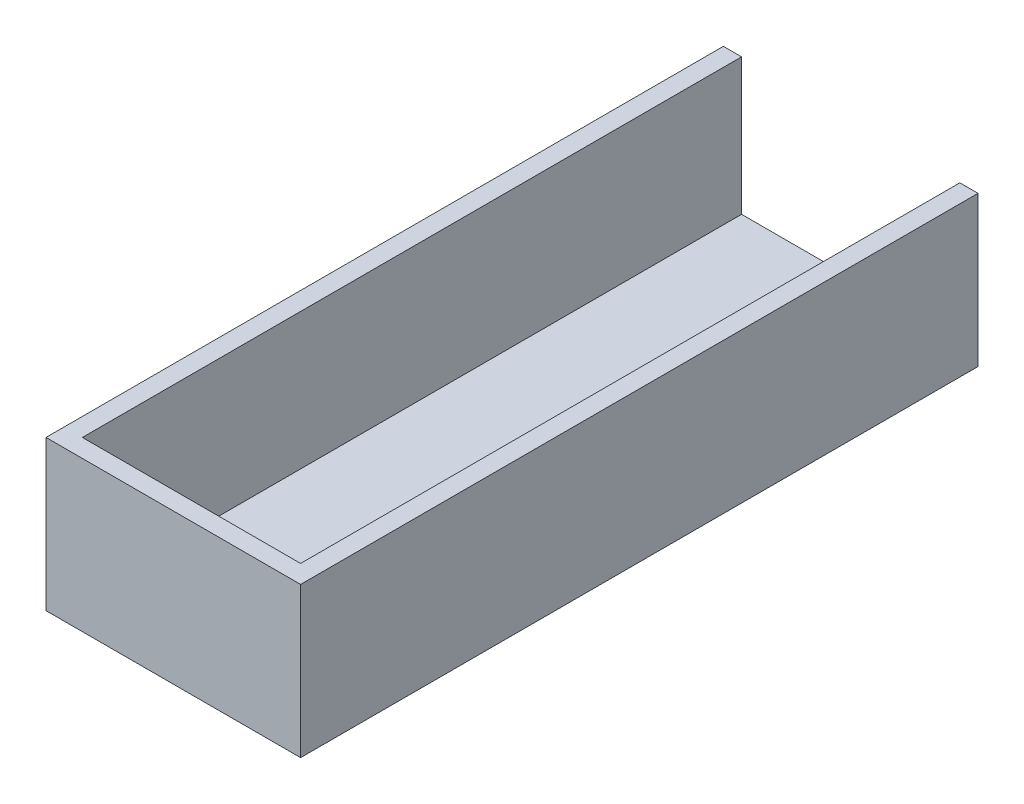
ISO-10303-21;
HEADER;
FILE_DESCRIPTION(('STEP AP214'),'2;1');
FILE_NAME('part.step','',(''),(''),'','','');
FILE_SCHEMA(('AUTOMOTIVE_DESIGN { 1 0 10303 214 1 1 1 1 }'));
ENDSEC;
DATA;
#1=APPLICATION_CONTEXT('core data for automotive mechanical design processes');
#2=APPLICATION_PROTOCOL_DEFINITION('international standard','automotive_design',2000,#1);
#3=PRODUCT_CONTEXT('',#1,'mechanical');
#4=PRODUCT('Part','Part','',(#3));
#5=PRODUCT_RELATED_PRODUCT_CATEGORY('part','',(#4));
#6=PRODUCT_DEFINITION_FORMATION('','',#4);
#7=PRODUCT_DEFINITION_CONTEXT('part definition',#1,'design');
#8=PRODUCT_DEFINITION('design','',#6,#7);
#9=PRODUCT_DEFINITION_SHAPE('','',#8);
#10=(LENGTH_UNIT() NAMED_UNIT(*) SI_UNIT(.MILLI.,.METRE.));
#11=(NAMED_UNIT(*) PLANE_ANGLE_UNIT() SI_UNIT($,.RADIAN.));
#12=(NAMED_UNIT(*) SI_UNIT($,.STERADIAN.) SOLID_ANGLE_UNIT());
#13=UNCERTAINTY_MEASURE_WITH_UNIT(LENGTH_MEASURE(1.E-05),#10,'distance_accuracy_value','');
#14=(GEOMETRIC_REPRESENTATION_CONTEXT(3) GLOBAL_UNCERTAINTY_ASSIGNED_CONTEXT((#13)) GLOBAL_UNIT_ASSIGNED_CONTEXT((#10,
#11,#12)) REPRESENTATION_CONTEXT('',''));
#15=CARTESIAN_POINT('',(0.,0.,0.));
#16=DIRECTION('',(0.,0.,1.));
#17=DIRECTION('',(1.,0.,0.));
#18=AXIS2_PLACEMENT_3D('',#15,#16,#17);
#19=CARTESIAN_POINT('',(28.,33.,-74.5));
#20=DIRECTION('',(-1.,0.,0.));
#21=DIRECTION('',(0.,0.,1.));
#22=AXIS2_PLACEMENT_3D('',#19,#20,#21);
#23=PLANE('',#22);
#24=DIRECTION('',(0.,0.,-1.));
#25=VECTOR('',#24,1.);
#26=CARTESIAN_POINT('',(28.,0.,-74.5));
#27=LINE('',#26,#25);
#28=CARTESIAN_POINT('',(28.,0.,74.5));
#29=VERTEX_POINT('',#28);
#30=CARTESIAN_POINT('',(28.,0.,-74.5));
#31=VERTEX_POINT('',#30);
#32=EDGE_CURVE('E138',#29,#31,#27,.T.);
#33=ORIENTED_EDGE('',*,*,#32,.T.);
#34=DIRECTION('',(0.,-1.,0.));
#35=VECTOR('',#34,1.);
#36=CARTESIAN_POINT('',(28.,33.,-74.5));
#37=LINE('',#36,#35);
#38=CARTESIAN_POINT('',(28.,33.,-74.5));
#39=VERTEX_POINT('',#38);
#40=EDGE_CURVE('E11',#39,#31,#37,.T.);
#41=ORIENTED_EDGE('',*,*,#40,.F.);
#42=DIRECTION('',(0.,0.,-1.));
#43=VECTOR('',#42,1.);
#44=CARTESIAN_POINT('',(28.,33.,-74.5));
#45=LINE('',#44,#43);
#46=CARTESIAN_POINT('',(28.,33.,74.5));
#47=VERTEX_POINT('',#46);
#48=EDGE_CURVE('E142',#47,#39,#45,.T.);
#49=ORIENTED_EDGE('',*,*,#48,.F.);
#50=DIRECTION('',(0.,-1.,0.));
#51=VECTOR('',#50,1.);
#52=CARTESIAN_POINT('',(28.,33.,74.5));
#53=LINE('',#52,#51);
#54=EDGE_CURVE('E149',#47,#29,#53,.T.);
#55=ORIENTED_EDGE('',*,*,#54,.T.);
#56=EDGE_LOOP('',(#33,#41,#49,#55));
#57=FACE_BOUND('',#56,.T.);
#58=ADVANCED_FACE('F33',(#57),#23,.F.);
#59=CARTESIAN_POINT('',(-28.,33.,-74.5));
#60=DIRECTION('',(0.,0.,1.));
#61=DIRECTION('',(1.,0.,0.));
#62=AXIS2_PLACEMENT_3D('',#59,#60,#61);
#63=PLANE('',#62);
#64=DIRECTION('',(-1.,0.,0.));
#65=VECTOR('',#64,1.);
#66=CARTESIAN_POINT('',(-28.,33.,-74.5));
#67=LINE('',#66,#65);
#68=CARTESIAN_POINT('',(-24.,33.,-74.5));
#69=VERTEX_POINT('',#68);
#70=CARTESIAN_POINT('',(-28.,33.,-74.5));
#71=VERTEX_POINT('',#70);
#72=EDGE_CURVE('E144',#69,#71,#67,.T.);
#73=ORIENTED_EDGE('',*,*,#72,.F.);
#74=DIRECTION('',(0.,1.,0.));
#75=VECTOR('',#74,1.);
#76=CARTESIAN_POINT('',(-24.,3.,-74.5));
#77=LINE('',#76,#75);
#78=CARTESIAN_POINT('',(-24.,3.,-74.5));
#79=VERTEX_POINT('',#78);
#80=EDGE_CURVE('E136',#79,#69,#77,.T.);
#81=ORIENTED_EDGE('',*,*,#80,.F.);
#82=DIRECTION('',(-1.,0.,0.));
#83=VECTOR('',#82,1.);
#84=CARTESIAN_POINT('',(-24.,3.,-74.5));
#85=LINE('',#84,#83);
#86=CARTESIAN_POINT('',(24.,3.,-74.5));
#87=VERTEX_POINT('',#86);
#88=EDGE_CURVE('E114',#87,#79,#85,.T.);
#89=ORIENTED_EDGE('',*,*,#88,.F.);
#90=DIRECTION('',(0.,1.,0.));
#91=VECTOR('',#90,1.);
#92=CARTESIAN_POINT('',(24.,3.,-74.5));
#93=LINE('',#92,#91);
#94=CARTESIAN_POINT('',(24.,33.,-74.5));
#95=VERTEX_POINT('',#94);
#96=EDGE_CURVE('E139',#87,#95,#93,.T.);
#97=ORIENTED_EDGE('',*,*,#96,.T.);
#98=EDGE_CURVE('E84',#39,#95,#67,.T.);
#99=ORIENTED_EDGE('',*,*,#98,.F.);
#100=ORIENTED_EDGE('',*,*,#40,.T.);
#101=DIRECTION('',(-1.,0.,0.));
#102=VECTOR('',#101,1.);
#103=CARTESIAN_POINT('',(-28.,0.,-74.5));
#104=LINE('',#103,#102);
#105=CARTESIAN_POINT('',(-28.,0.,-74.5));
#106=VERTEX_POINT('',#105);
#107=EDGE_CURVE('E152',#31,#106,#104,.T.);
#108=ORIENTED_EDGE('',*,*,#107,.T.);
#109=DIRECTION('',(0.,-1.,0.));
#110=VECTOR('',#109,1.);
#111=CARTESIAN_POINT('',(-28.,33.,-74.5));
#112=LINE('',#111,#110);
#113=EDGE_CURVE('E40',#71,#106,#112,.T.);
#114=ORIENTED_EDGE('',*,*,#113,.F.);
#115=EDGE_LOOP('',(#73,#81,#89,#97,#99,#100,#108,#114));
#116=FACE_BOUND('',#115,.T.);
#117=ADVANCED_FACE('F182',(#116),#63,.F.);
#118=CARTESIAN_POINT('',(-28.,33.,-74.5));
#119=DIRECTION('',(1.,0.,0.));
#120=DIRECTION('',(0.,0.,-1.));
#121=AXIS2_PLACEMENT_3D('',#118,#119,#120);
#122=PLANE('',#121);
#123=DIRECTION('',(0.,0.,1.));
#124=VECTOR('',#123,1.);
#125=CARTESIAN_POINT('',(-28.,0.,-74.5));
#126=LINE('',#125,#124);
#127=CARTESIAN_POINT('',(-28.,0.,74.5));
#128=VERTEX_POINT('',#127);
#129=EDGE_CURVE('E154',#106,#128,#126,.T.);
#130=ORIENTED_EDGE('',*,*,#129,.T.);
#131=DIRECTION('',(0.,-1.,0.));
#132=VECTOR('',#131,1.);
#133=CARTESIAN_POINT('',(-28.,33.,74.5));
#134=LINE('',#133,#132);
#135=CARTESIAN_POINT('',(-28.,33.,74.5));
#136=VERTEX_POINT('',#135);
#137=EDGE_CURVE('E158',#136,#128,#134,.T.);
#138=ORIENTED_EDGE('',*,*,#137,.F.);
#139=DIRECTION('',(0.,0.,1.));
#140=VECTOR('',#139,1.);
#141=CARTESIAN_POINT('',(-28.,33.,-74.5));
#142=LINE('',#141,#140);
#143=EDGE_CURVE('E146',#71,#136,#142,.T.);
#144=ORIENTED_EDGE('',*,*,#143,.F.);
#145=ORIENTED_EDGE('',*,*,#113,.T.);
#146=EDGE_LOOP('',(#130,#138,#144,#145));
#147=FACE_BOUND('',#146,.T.);
#148=ADVANCED_FACE('F164',(#147),#122,.F.);
#149=CARTESIAN_POINT('',(-28.,33.,74.5));
#150=DIRECTION('',(0.,0.,-1.));
#151=DIRECTION('',(-1.,0.,0.));
#152=AXIS2_PLACEMENT_3D('',#149,#150,#151);
#153=PLANE('',#152);
#154=DIRECTION('',(1.,0.,0.));
#155=VECTOR('',#154,1.);
#156=CARTESIAN_POINT('',(-28.,0.,74.5));
#157=LINE('',#156,#155);
#158=EDGE_CURVE('E77',#128,#29,#157,.T.);
#159=ORIENTED_EDGE('',*,*,#158,.T.);
#160=ORIENTED_EDGE('',*,*,#54,.F.);
#161=DIRECTION('',(1.,0.,0.));
#162=VECTOR('',#161,1.);
#163=CARTESIAN_POINT('',(-28.,33.,74.5));
#164=LINE('',#163,#162);
#165=EDGE_CURVE('E56',#136,#47,#164,.T.);
#166=ORIENTED_EDGE('',*,*,#165,.F.);
#167=ORIENTED_EDGE('',*,*,#137,.T.);
#168=EDGE_LOOP('',(#159,#160,#166,#167));
#169=FACE_BOUND('',#168,.T.);
#170=ADVANCED_FACE('F173',(#169),#153,.F.);
#171=CARTESIAN_POINT('',(0.,33.,0.));
#172=DIRECTION('',(0.,1.,0.));
#173=DIRECTION('',(0.,0.,1.));
#174=AXIS2_PLACEMENT_3D('',#171,#172,#173);
#175=PLANE('',#174);
#176=DIRECTION('',(0.,0.,1.));
#177=VECTOR('',#176,1.);
#178=CARTESIAN_POINT('',(-24.,33.,70.5));
#179=LINE('',#178,#177);
#180=CARTESIAN_POINT('',(-24.,33.,70.5));
#181=VERTEX_POINT('',#180);
#182=EDGE_CURVE('E47',#69,#181,#179,.T.);
#183=ORIENTED_EDGE('',*,*,#182,.F.);
#184=ORIENTED_EDGE('',*,*,#72,.T.);
#185=ORIENTED_EDGE('',*,*,#143,.T.);
#186=ORIENTED_EDGE('',*,*,#165,.T.);
#187=ORIENTED_EDGE('',*,*,#48,.T.);
#188=ORIENTED_EDGE('',*,*,#98,.T.);
#189=DIRECTION('',(0.,0.,-1.));
#190=VECTOR('',#189,1.);
#191=CARTESIAN_POINT('',(24.,33.,70.5));
#192=LINE('',#191,#190);
#193=CARTESIAN_POINT('',(24.,33.,70.5));
#194=VERTEX_POINT('',#193);
#195=EDGE_CURVE('E127',#194,#95,#192,.T.);
#196=ORIENTED_EDGE('',*,*,#195,.F.);
#197=DIRECTION('',(1.,0.,0.));
#198=VECTOR('',#197,1.);
#199=CARTESIAN_POINT('',(-24.,33.,70.5));
#200=LINE('',#199,#198);
#201=EDGE_CURVE('E129',#181,#194,#200,.T.);
#202=ORIENTED_EDGE('',*,*,#201,.F.);
#203=EDGE_LOOP('',(#183,#184,#185,#186,#187,#188,#196,#202));
#204=FACE_BOUND('',#203,.T.);
#205=ADVANCED_FACE('F175',(#204),#175,.T.);
#206=CARTESIAN_POINT('',(0.,0.,0.));
#207=DIRECTION('',(0.,1.,0.));
#208=DIRECTION('',(0.,0.,1.));
#209=AXIS2_PLACEMENT_3D('',#206,#207,#208);
#210=PLANE('',#209);
#211=ORIENTED_EDGE('',*,*,#32,.F.);
#212=ORIENTED_EDGE('',*,*,#158,.F.);
#213=ORIENTED_EDGE('',*,*,#129,.F.);
#214=ORIENTED_EDGE('',*,*,#107,.F.);
#215=EDGE_LOOP('',(#211,#212,#213,#214));
#216=FACE_BOUND('',#215,.T.);
#217=ADVANCED_FACE('F169',(#216),#210,.F.);
#218=CARTESIAN_POINT('',(-24.,3.,70.5));
#219=DIRECTION('',(-1.,0.,0.));
#220=DIRECTION('',(0.,0.,1.));
#221=AXIS2_PLACEMENT_3D('',#218,#219,#220);
#222=PLANE('',#221);
#223=ORIENTED_EDGE('',*,*,#182,.T.);
#224=DIRECTION('',(0.,1.,0.));
#225=VECTOR('',#224,1.);
#226=CARTESIAN_POINT('',(-24.,3.,70.5));
#227=LINE('',#226,#225);
#228=CARTESIAN_POINT('',(-24.,3.,70.5));
#229=VERTEX_POINT('',#228);
#230=EDGE_CURVE('E104',#229,#181,#227,.T.);
#231=ORIENTED_EDGE('',*,*,#230,.F.);
#232=DIRECTION('',(0.,0.,1.));
#233=VECTOR('',#232,1.);
#234=CARTESIAN_POINT('',(-24.,3.,70.5));
#235=LINE('',#234,#233);
#236=EDGE_CURVE('E108',#79,#229,#235,.T.);
#237=ORIENTED_EDGE('',*,*,#236,.F.);
#238=ORIENTED_EDGE('',*,*,#80,.T.);
#239=EDGE_LOOP('',(#223,#231,#237,#238));
#240=FACE_BOUND('',#239,.T.);
#241=ADVANCED_FACE('F106',(#240),#222,.F.);
#242=CARTESIAN_POINT('',(24.,3.,70.5));
#243=DIRECTION('',(1.,0.,0.));
#244=DIRECTION('',(0.,0.,-1.));
#245=AXIS2_PLACEMENT_3D('',#242,#243,#244);
#246=PLANE('',#245);
#247=ORIENTED_EDGE('',*,*,#195,.T.);
#248=ORIENTED_EDGE('',*,*,#96,.F.);
#249=DIRECTION('',(0.,0.,-1.));
#250=VECTOR('',#249,1.);
#251=CARTESIAN_POINT('',(24.,3.,70.5));
#252=LINE('',#251,#250);
#253=CARTESIAN_POINT('',(24.,3.,70.5));
#254=VERTEX_POINT('',#253);
#255=EDGE_CURVE('E122',#254,#87,#252,.T.);
#256=ORIENTED_EDGE('',*,*,#255,.F.);
#257=DIRECTION('',(0.,1.,0.));
#258=VECTOR('',#257,1.);
#259=CARTESIAN_POINT('',(24.,3.,70.5));
#260=LINE('',#259,#258);
#261=EDGE_CURVE('E113',#254,#194,#260,.T.);
#262=ORIENTED_EDGE('',*,*,#261,.T.);
#263=EDGE_LOOP('',(#247,#248,#256,#262));
#264=FACE_BOUND('',#263,.T.);
#265=ADVANCED_FACE('F193',(#264),#246,.F.);
#266=CARTESIAN_POINT('',(-24.,3.,70.5));
#267=DIRECTION('',(0.,0.,1.));
#268=DIRECTION('',(1.,0.,0.));
#269=AXIS2_PLACEMENT_3D('',#266,#267,#268);
#270=PLANE('',#269);
#271=ORIENTED_EDGE('',*,*,#201,.T.);
#272=ORIENTED_EDGE('',*,*,#261,.F.);
#273=DIRECTION('',(1.,0.,0.));
#274=VECTOR('',#273,1.);
#275=CARTESIAN_POINT('',(-24.,3.,70.5));
#276=LINE('',#275,#274);
#277=EDGE_CURVE('E117',#229,#254,#276,.T.);
#278=ORIENTED_EDGE('',*,*,#277,.F.);
#279=ORIENTED_EDGE('',*,*,#230,.T.);
#280=EDGE_LOOP('',(#271,#272,#278,#279));
#281=FACE_BOUND('',#280,.T.);
#282=ADVANCED_FACE('F118',(#281),#270,.F.);
#283=CARTESIAN_POINT('',(0.,3.,0.));
#284=DIRECTION('',(0.,-1.,0.));
#285=DIRECTION('',(0.,0.,-1.));
#286=AXIS2_PLACEMENT_3D('',#283,#284,#285);
#287=PLANE('',#286);
#288=ORIENTED_EDGE('',*,*,#236,.T.);
#289=ORIENTED_EDGE('',*,*,#277,.T.);
#290=ORIENTED_EDGE('',*,*,#255,.T.);
#291=ORIENTED_EDGE('',*,*,#88,.T.);
#292=EDGE_LOOP('',(#288,#289,#290,#291));
#293=FACE_BOUND('',#292,.T.);
#294=ADVANCED_FACE('F124',(#293),#287,.F.);
#295=CLOSED_SHELL('',(#58,#117,#148,#170,#205,#217,#241,#265,#282,#294));
#296=MANIFOLD_SOLID_BREP('B2',#295);
#297=ADVANCED_BREP_SHAPE_REPRESENTATION('',(#18,#296),#14);
#298=SHAPE_DEFINITION_REPRESENTATION(#9,#297);
ENDSEC;
END-ISO-10303-21;
